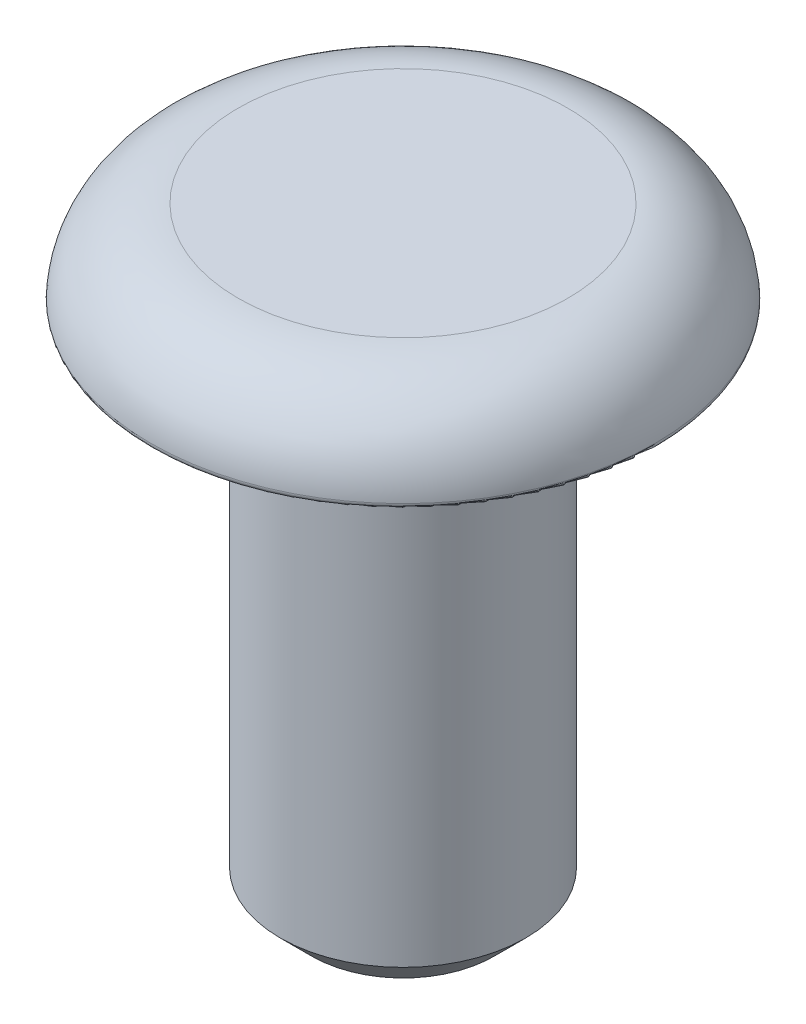
ISO-10303-21;
HEADER;
FILE_DESCRIPTION(('STEP AP214'),'2;1');
FILE_NAME('part.step','',(''),(''),'','','');
FILE_SCHEMA(('AUTOMOTIVE_DESIGN { 1 0 10303 214 1 1 1 1 }'));
ENDSEC;
DATA;
#1=APPLICATION_CONTEXT('core data for automotive mechanical design processes');
#2=APPLICATION_PROTOCOL_DEFINITION('international standard','automotive_design',2000,#1);
#3=PRODUCT_CONTEXT('',#1,'mechanical');
#4=PRODUCT('Part','Part','',(#3));
#5=PRODUCT_RELATED_PRODUCT_CATEGORY('part','',(#4));
#6=PRODUCT_DEFINITION_FORMATION('','',#4);
#7=PRODUCT_DEFINITION_CONTEXT('part definition',#1,'design');
#8=PRODUCT_DEFINITION('design','',#6,#7);
#9=PRODUCT_DEFINITION_SHAPE('','',#8);
#10=(LENGTH_UNIT() NAMED_UNIT(*) SI_UNIT(.MILLI.,.METRE.));
#11=(NAMED_UNIT(*) PLANE_ANGLE_UNIT() SI_UNIT($,.RADIAN.));
#12=(NAMED_UNIT(*) SI_UNIT($,.STERADIAN.) SOLID_ANGLE_UNIT());
#13=UNCERTAINTY_MEASURE_WITH_UNIT(LENGTH_MEASURE(1.E-05),#10,'distance_accuracy_value','');
#14=(GEOMETRIC_REPRESENTATION_CONTEXT(3) GLOBAL_UNCERTAINTY_ASSIGNED_CONTEXT((#13)) GLOBAL_UNIT_ASSIGNED_CONTEXT((#10,
#11,#12)) REPRESENTATION_CONTEXT('',''));
#15=CARTESIAN_POINT('',(0.,0.,0.));
#16=DIRECTION('',(0.,0.,1.));
#17=DIRECTION('',(1.,0.,0.));
#18=AXIS2_PLACEMENT_3D('',#15,#16,#17);
#19=CARTESIAN_POINT('',(0.,4.699,0.));
#20=DIRECTION('',(0.,-1.,0.));
#21=DIRECTION('',(0.,0.,-1.));
#22=AXIS2_PLACEMENT_3D('',#19,#20,#21);
#23=CYLINDRICAL_SURFACE('',#22,1.11125);
#24=CARTESIAN_POINT('',(0.,0.28575,0.));
#25=DIRECTION('',(0.,1.,0.));
#26=DIRECTION('',(0.,0.,1.));
#27=AXIS2_PLACEMENT_3D('',#24,#25,#26);
#28=CIRCLE('',#27,1.11125);
#29=CARTESIAN_POINT('',(0.,0.28575,1.11125));
#30=VERTEX_POINT('',#29);
#31=EDGE_CURVE('E38',#30,#30,#28,.T.);
#32=ORIENTED_EDGE('',*,*,#31,.T.);
#33=EDGE_LOOP('',(#32));
#34=FACE_BOUND('',#33,.T.);
#35=CARTESIAN_POINT('',(0.,4.699,0.));
#36=DIRECTION('',(0.,1.,0.));
#37=DIRECTION('',(0.,0.,1.));
#38=AXIS2_PLACEMENT_3D('',#35,#36,#37);
#39=CIRCLE('',#38,1.11125);
#40=CARTESIAN_POINT('',(0.,4.699,1.11125));
#41=VERTEX_POINT('',#40);
#42=EDGE_CURVE('E54',#41,#41,#39,.T.);
#43=ORIENTED_EDGE('',*,*,#42,.F.);
#44=EDGE_LOOP('',(#43));
#45=FACE_BOUND('',#44,.T.);
#46=ADVANCED_FACE('F31',(#34,#45),#23,.T.);
#47=CARTESIAN_POINT('',(0.,0.,0.));
#48=DIRECTION('',(0.,1.,0.));
#49=DIRECTION('',(0.,0.,1.));
#50=AXIS2_PLACEMENT_3D('',#47,#48,#49);
#51=PLANE('',#50);
#52=CARTESIAN_POINT('',(0.,0.,0.));
#53=DIRECTION('',(0.,1.,0.));
#54=DIRECTION('',(0.,0.,1.));
#55=AXIS2_PLACEMENT_3D('',#52,#53,#54);
#56=CIRCLE('',#55,0.825499999999999);
#57=CARTESIAN_POINT('',(0.,0.,0.825499999999999));
#58=VERTEX_POINT('',#57);
#59=EDGE_CURVE('E10',#58,#58,#56,.F.);
#60=ORIENTED_EDGE('',*,*,#59,.T.);
#61=EDGE_LOOP('',(#60));
#62=FACE_BOUND('',#61,.T.);
#63=ADVANCED_FACE('F61',(#62),#51,.F.);
#64=CARTESIAN_POINT('',(0.,4.699,0.));
#65=DIRECTION('',(0.,1.,0.));
#66=DIRECTION('',(0.,0.,1.));
#67=AXIS2_PLACEMENT_3D('',#64,#65,#66);
#68=PLANE('',#67);
#69=CARTESIAN_POINT('',(0.,4.699,0.));
#70=DIRECTION('',(0.,1.,0.));
#71=DIRECTION('',(0.,0.,1.));
#72=AXIS2_PLACEMENT_3D('',#69,#70,#71);
#73=CIRCLE('',#72,2.23473513768795);
#74=CARTESIAN_POINT('',(0.,4.699,2.23473513768795));
#75=VERTEX_POINT('',#74);
#76=EDGE_CURVE('E42',#75,#75,#73,.F.);
#77=ORIENTED_EDGE('',*,*,#76,.T.);
#78=EDGE_LOOP('',(#77));
#79=FACE_BOUND('',#78,.T.);
#80=ORIENTED_EDGE('',*,*,#42,.T.);
#81=EDGE_LOOP('',(#80));
#82=FACE_BOUND('',#81,.T.);
#83=ADVANCED_FACE('F58',(#79,#82),#68,.F.);
#84=CARTESIAN_POINT('',(0.,5.49275,0.));
#85=DIRECTION('',(0.,1.,0.));
#86=DIRECTION('',(0.,0.,1.));
#87=AXIS2_PLACEMENT_3D('',#84,#85,#86);
#88=PLANE('',#87);
#89=CARTESIAN_POINT('',(0.,5.49275,0.));
#90=DIRECTION('',(0.,1.,0.));
#91=DIRECTION('',(0.,0.,1.));
#92=AXIS2_PLACEMENT_3D('',#89,#90,#91);
#93=CIRCLE('',#92,1.49225);
#94=CARTESIAN_POINT('',(0.,5.49275,1.49225));
#95=VERTEX_POINT('',#94);
#96=EDGE_CURVE('E51',#95,#95,#93,.T.);
#97=ORIENTED_EDGE('',*,*,#96,.T.);
#98=EDGE_LOOP('',(#97));
#99=FACE_BOUND('',#98,.T.);
#100=ADVANCED_FACE('F72',(#99),#88,.T.);
#101=CARTESIAN_POINT('',(0.,4.699,0.));
#102=DIRECTION('',(0.,1.,0.));
#103=DIRECTION('',(0.,0.,1.));
#104=AXIS2_PLACEMENT_3D('',#101,#102,#103);
#105=TOROIDAL_SURFACE('',#104,1.49225,0.79375);
#106=CARTESIAN_POINT('',(0.,4.75191666666667,0.));
#107=DIRECTION('',(0.,-1.,0.));
#108=DIRECTION('',(0.,0.,-1.));
#109=AXIS2_PLACEMENT_3D('',#106,#107,#108);
#110=CIRCLE('',#109,2.28423414686715);
#111=CARTESIAN_POINT('',(0.,4.75191666666667,-2.28423414686715));
#112=VERTEX_POINT('',#111);
#113=EDGE_CURVE('E46',#112,#112,#110,.F.);
#114=ORIENTED_EDGE('',*,*,#113,.T.);
#115=EDGE_LOOP('',(#114));
#116=FACE_BOUND('',#115,.T.);
#117=ORIENTED_EDGE('',*,*,#96,.F.);
#118=EDGE_LOOP('',(#117));
#119=FACE_BOUND('',#118,.T.);
#120=ADVANCED_FACE('F69',(#116,#119),#105,.T.);
#121=CARTESIAN_POINT('',(0.,4.748609375,0.));
#122=DIRECTION('',(0.,1.,0.));
#123=DIRECTION('',(0.,0.,1.));
#124=AXIS2_PLACEMENT_3D('',#121,#122,#123);
#125=TOROIDAL_SURFACE('',#124,2.23473513768795,0.049609375);
#126=ORIENTED_EDGE('',*,*,#76,.F.);
#127=EDGE_LOOP('',(#126));
#128=FACE_BOUND('',#127,.T.);
#129=ORIENTED_EDGE('',*,*,#113,.F.);
#130=EDGE_LOOP('',(#129));
#131=FACE_BOUND('',#130,.T.);
#132=ADVANCED_FACE('F71',(#128,#131),#125,.T.);
#133=CARTESIAN_POINT('',(0.,0.28575,0.));
#134=DIRECTION('',(0.,1.,0.));
#135=DIRECTION('',(0.,0.,1.));
#136=AXIS2_PLACEMENT_3D('',#133,#134,#135);
#137=CONICAL_SURFACE('',#136,1.11125,0.785398163397451);
#138=ORIENTED_EDGE('',*,*,#59,.F.);
#139=EDGE_LOOP('',(#138));
#140=FACE_BOUND('',#139,.T.);
#141=ORIENTED_EDGE('',*,*,#31,.F.);
#142=EDGE_LOOP('',(#141));
#143=FACE_BOUND('',#142,.T.);
#144=ADVANCED_FACE('F33',(#140,#143),#137,.T.);
#145=CLOSED_SHELL('',(#46,#63,#83,#100,#120,#132,#144));
#146=MANIFOLD_SOLID_BREP('B2',#145);
#147=ADVANCED_BREP_SHAPE_REPRESENTATION('',(#18,#146),#14);
#148=SHAPE_DEFINITION_REPRESENTATION(#9,#147);
ENDSEC;
END-ISO-10303-21;
